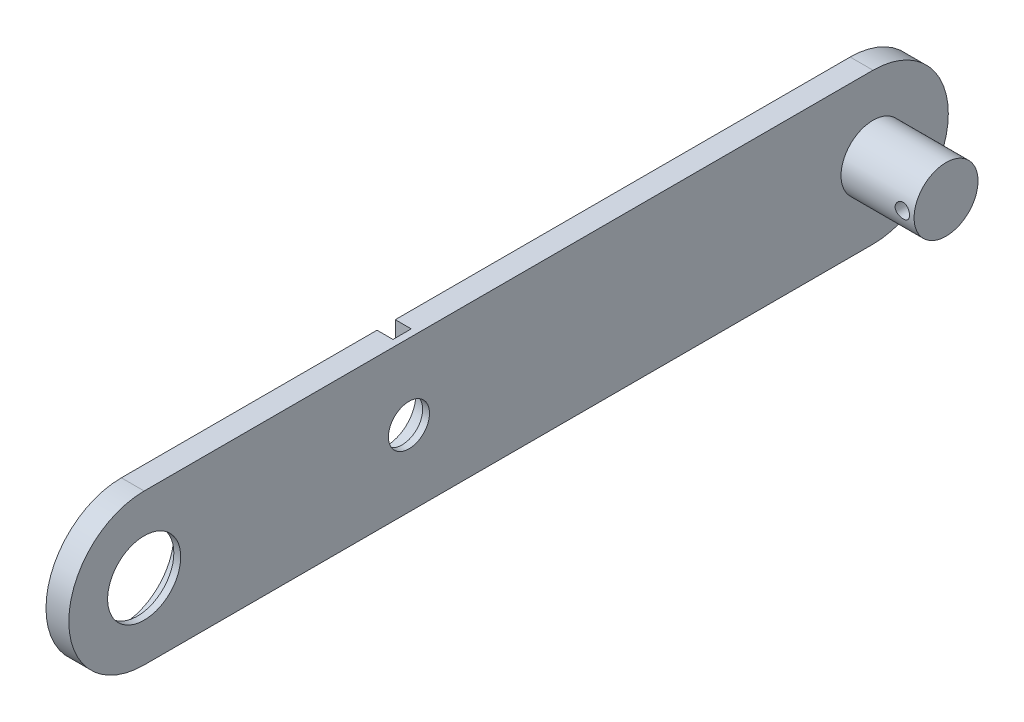
ISO-10303-21;
HEADER;
FILE_DESCRIPTION(('STEP AP214'),'2;1');
FILE_NAME('part.step','',(''),(''),'','','');
FILE_SCHEMA(('AUTOMOTIVE_DESIGN { 1 0 10303 214 1 1 1 1 }'));
ENDSEC;
DATA;
#1=APPLICATION_CONTEXT('core data for automotive mechanical design processes');
#2=APPLICATION_PROTOCOL_DEFINITION('international standard','automotive_design',2000,#1);
#3=PRODUCT_CONTEXT('',#1,'mechanical');
#4=PRODUCT('Part','Part','',(#3));
#5=PRODUCT_RELATED_PRODUCT_CATEGORY('part','',(#4));
#6=PRODUCT_DEFINITION_FORMATION('','',#4);
#7=PRODUCT_DEFINITION_CONTEXT('part definition',#1,'design');
#8=PRODUCT_DEFINITION('design','',#6,#7);
#9=PRODUCT_DEFINITION_SHAPE('','',#8);
#10=(LENGTH_UNIT() NAMED_UNIT(*) SI_UNIT(.MILLI.,.METRE.));
#11=(NAMED_UNIT(*) PLANE_ANGLE_UNIT() SI_UNIT($,.RADIAN.));
#12=(NAMED_UNIT(*) SI_UNIT($,.STERADIAN.) SOLID_ANGLE_UNIT());
#13=UNCERTAINTY_MEASURE_WITH_UNIT(LENGTH_MEASURE(1.E-05),#10,'distance_accuracy_value','');
#14=(GEOMETRIC_REPRESENTATION_CONTEXT(3) GLOBAL_UNCERTAINTY_ASSIGNED_CONTEXT((#13)) GLOBAL_UNIT_ASSIGNED_CONTEXT((#10,
#11,#12)) REPRESENTATION_CONTEXT('',''));
#15=CARTESIAN_POINT('',(0.,0.,0.));
#16=DIRECTION('',(0.,0.,1.));
#17=DIRECTION('',(1.,0.,0.));
#18=AXIS2_PLACEMENT_3D('',#15,#16,#17);
#19=CARTESIAN_POINT('',(17.5,0.,-101.62897727145));
#20=DIRECTION('',(-1.,0.,0.));
#21=DIRECTION('',(0.,0.,1.));
#22=AXIS2_PLACEMENT_3D('',#19,#20,#21);
#23=CYLINDRICAL_SURFACE('',#22,7.);
#24=CARTESIAN_POINT('',(16.5,0.,-94.6289772714496));
#25=CARTESIAN_POINT('',(16.4999971095468,-0.0872899861213126,-94.628978869588));
#26=CARTESIAN_POINT('',(16.4927188067638,-0.17461436314791,-94.6306265614614));
#27=CARTESIAN_POINT('',(16.4638306572922,-0.346778424822504,-94.637040293797));
#28=CARTESIAN_POINT('',(16.4422109743029,-0.431616362369988,-94.641808474474));
#29=CARTESIAN_POINT('',(16.3853548813518,-0.596294910858169,-94.6539328335885));
#30=CARTESIAN_POINT('',(16.3501331068488,-0.67614078619026,-94.6612862296488));
#31=CARTESIAN_POINT('',(16.267120088108,-0.828787702125348,-94.6777893984412));
#32=CARTESIAN_POINT('',(16.2193290227071,-0.901588842941153,-94.686939145614));
#33=CARTESIAN_POINT('',(16.1116785187539,-1.03931385877118,-94.7062075011215));
#34=CARTESIAN_POINT('',(16.0516469900669,-1.10410147154966,-94.7163387021759));
#35=CARTESIAN_POINT('',(15.9215888912573,-1.22277828306539,-94.7363403776201));
#36=CARTESIAN_POINT('',(15.8515613889837,-1.27666646426783,-94.7462108275922));
#37=CARTESIAN_POINT('',(15.7024820466169,-1.3726234409646,-94.7646980864747));
#38=CARTESIAN_POINT('',(15.6233337567596,-1.41454577335379,-94.7732987858579));
#39=CARTESIAN_POINT('',(15.4588898872216,-1.4844411000008,-94.7880914024876));
#40=CARTESIAN_POINT('',(15.3735950903043,-1.51241586691361,-94.7942836258155));
#41=CARTESIAN_POINT('',(15.2007615544076,-1.55316884379517,-94.8034296909133));
#42=CARTESIAN_POINT('',(15.1132826605646,-1.5661890465039,-94.8064350390268));
#43=CARTESIAN_POINT('',(14.937334512748,-1.57741600984558,-94.8090216650634));
#44=CARTESIAN_POINT('',(14.8488653893677,-1.57562470138648,-94.8086033893086));
#45=CARTESIAN_POINT('',(14.6752574941243,-1.5574739132486,-94.8044365959482));
#46=CARTESIAN_POINT('',(14.590087404167,-1.5413969001679,-94.8007526526789));
#47=CARTESIAN_POINT('',(14.4236851420759,-1.49557916917239,-94.7905718605375));
#48=CARTESIAN_POINT('',(14.3424532026754,-1.46583764481035,-94.7840748456459));
#49=CARTESIAN_POINT('',(14.1854460629172,-1.39327938401514,-94.7689371657944));
#50=CARTESIAN_POINT('',(14.1097222716766,-1.35035520798153,-94.7602790001066));
#51=CARTESIAN_POINT('',(13.966448398987,-1.25272556507102,-94.7418051417533));
#52=CARTESIAN_POINT('',(13.8988994950352,-1.19801840413961,-94.7319892827368));
#53=CARTESIAN_POINT('',(13.7722679841618,-1.07688659013386,-94.7120299478526));
#54=CARTESIAN_POINT('',(13.713414950386,-1.01022207908191,-94.701884119964));
#55=CARTESIAN_POINT('',(13.6076854091123,-0.867853161230144,-94.6826125485182));
#56=CARTESIAN_POINT('',(13.560809143765,-0.792148571700175,-94.6734868255879));
#57=CARTESIAN_POINT('',(13.4803019020482,-0.633559280225835,-94.6572513005981));
#58=CARTESIAN_POINT('',(13.4467023746,-0.550658090856842,-94.6501462960763));
#59=CARTESIAN_POINT('',(13.3939753402459,-0.38019065354933,-94.6387882160826));
#60=CARTESIAN_POINT('',(13.3748456035053,-0.292625126625219,-94.6345347011997));
#61=CARTESIAN_POINT('',(13.3519382509414,-0.117282647044653,-94.6294218762225));
#62=CARTESIAN_POINT('',(13.3478472286157,-0.0295486033449298,-94.6284932855919));
#63=CARTESIAN_POINT('',(13.354282034909,0.145349409003764,-94.6299401878712));
#64=CARTESIAN_POINT('',(13.3648068112493,0.232513418239007,-94.6323154429175));
#65=CARTESIAN_POINT('',(13.3999148165918,0.402749019106473,-94.6400592947118));
#66=CARTESIAN_POINT('',(13.4243324026057,0.485856519692085,-94.6453926042432));
#67=CARTESIAN_POINT('',(13.4863480307838,0.646795450537388,-94.6584550336394));
#68=CARTESIAN_POINT('',(13.5239472397701,0.724626412995977,-94.6661843655903));
#69=CARTESIAN_POINT('',(13.6119030356007,0.874089615853796,-94.6833515578167));
#70=CARTESIAN_POINT('',(13.6624421094229,0.945611667018305,-94.6928132543626));
#71=CARTESIAN_POINT('',(13.7746040955761,1.07927202933095,-94.7123492948554));
#72=CARTESIAN_POINT('',(13.8362285371484,1.14140904362229,-94.7224237232025));
#73=CARTESIAN_POINT('',(13.970253752316,1.25578477940571,-94.7422910501895));
#74=CARTESIAN_POINT('',(14.042841892365,1.30780588339238,-94.7520745748888));
#75=CARTESIAN_POINT('',(14.195907777316,1.39892136056197,-94.7700280602493));
#76=CARTESIAN_POINT('',(14.2763851749179,1.43801630244794,-94.7781980918919));
#77=CARTESIAN_POINT('',(14.44250870205,1.50189853021579,-94.7919187573394));
#78=CARTESIAN_POINT('',(14.5281220000794,1.52676781577292,-94.7974843690242));
#79=CARTESIAN_POINT('',(14.70245463474,1.56172934234186,-94.8053910700657));
#80=CARTESIAN_POINT('',(14.7911734385183,1.57182410581257,-94.8077327098481));
#81=CARTESIAN_POINT('',(14.9670009162417,1.57683786591717,-94.8088902314064));
#82=CARTESIAN_POINT('',(15.0540993849292,1.57210237871249,-94.8077863882727));
#83=CARTESIAN_POINT('',(15.2262228168791,1.54836598399252,-94.8023596411807));
#84=CARTESIAN_POINT('',(15.3112478075685,1.5293652652767,-94.798036779826));
#85=CARTESIAN_POINT('',(15.4765169830411,1.47780903924964,-94.7866993136607));
#86=CARTESIAN_POINT('',(15.5567784936471,1.44530659780169,-94.7796952551335));
#87=CARTESIAN_POINT('',(15.7107596286153,1.36771414019605,-94.7637810135434));
#88=CARTESIAN_POINT('',(15.7844785250585,1.32262272572057,-94.7548706187601));
#89=CARTESIAN_POINT('',(15.9249788048857,1.21999832474216,-94.7359099553552));
#90=CARTESIAN_POINT('',(15.9915785098901,1.1622203063352,-94.7258394150168));
#91=CARTESIAN_POINT('',(16.114250145116,1.03635584191832,-94.705826294047));
#92=CARTESIAN_POINT('',(16.1703196293617,0.968267007514182,-94.6958837436436));
#93=CARTESIAN_POINT('',(16.2710885449288,0.822572231851488,-94.6770826580714));
#94=CARTESIAN_POINT('',(16.3156190500476,0.744847129190773,-94.6682411169002));
#95=CARTESIAN_POINT('',(16.3909124410645,0.582830489017929,-94.6528101765245));
#96=CARTESIAN_POINT('',(16.421686560245,0.498544375427394,-94.6462189407933));
#97=CARTESIAN_POINT('',(16.4632806906157,0.345179203217054,-94.6371695668236));
#98=CARTESIAN_POINT('',(16.4770235207675,0.276912781529897,-94.6341168685487));
#99=CARTESIAN_POINT('',(16.4953841019366,0.139104811527382,-94.6300201336504));
#100=CARTESIAN_POINT('',(16.5000023034663,0.0695633263371569,-94.6289759978577));
#101=CARTESIAN_POINT('',(16.5,0.,-94.6289772714496));
#102=B_SPLINE_CURVE_WITH_KNOTS('',3,(#24,#25,#26,#27,#28,#29,#30,#31,#32,#33,#34,#35,#36,#37,
#38,#39,#40,#41,#42,#43,#44,#45,#46,#47,#48,#49,#50,#51,#52,#53,#54,#55,#56,#57,#58,#59,#60,#61,
#62,#63,#64,#65,#66,#67,#68,#69,#70,#71,#72,#73,#74,#75,#76,#77,#78,#79,#80,#81,#82,#83,#84,#85,
#86,#87,#88,#89,#90,#91,#92,#93,#94,#95,#96,#97,#98,#99,#100,#101),.UNSPECIFIED.,.T.,.F.,(4,2,2,
2,2,2,2,2,2,2,2,2,2,2,2,2,2,2,2,2,2,2,2,2,2,2,2,2,2,2,2,2,2,2,2,2,2,2,4),(0.,0.261615274364288,
0.523410168181868,0.784924159540375,1.04643443026112,1.31191208317623,1.57741450877731,
1.84603953754278,2.11463041691062,2.37881088860785,2.64295692086621,2.90199349988702,
3.16104536860018,3.42226722489961,3.68352666249189,3.95077507910684,4.2180288986187,
4.48591202722063,4.75375386588078,5.01598118451343,5.2781896248104,5.53733538902539,
5.79650409831639,6.05955111599233,6.32263444922333,6.59086867821547,6.85909110432859,
7.12575144278277,7.3923662489186,7.65281604288397,7.91326238987266,8.17269464613941,
8.43215573026739,8.69715527286611,8.96221629404097,9.2309626737525,9.49948919603384,
9.70798650616193,9.9164735218443),.UNSPECIFIED.);
#103=CARTESIAN_POINT('',(16.5,0.,-94.6289772714496));
#104=VERTEX_POINT('',#103);
#105=EDGE_CURVE('E59',#104,#104,#102,.T.);
#106=ORIENTED_EDGE('',*,*,#105,.T.);
#107=EDGE_LOOP('',(#106));
#108=FACE_BOUND('',#107,.T.);
#109=CARTESIAN_POINT('',(17.5,0.,-101.62897727145));
#110=DIRECTION('',(1.,0.,0.));
#111=DIRECTION('',(0.,0.,-1.));
#112=AXIS2_PLACEMENT_3D('',#109,#110,#111);
#113=CIRCLE('',#112,7.);
#114=CARTESIAN_POINT('',(17.5,0.,-108.62897727145));
#115=VERTEX_POINT('',#114);
#116=EDGE_CURVE('E207',#115,#115,#113,.T.);
#117=ORIENTED_EDGE('',*,*,#116,.F.);
#118=EDGE_LOOP('',(#117));
#119=FACE_BOUND('',#118,.T.);
#120=CARTESIAN_POINT('',(1.5,0.,-101.62897727145));
#121=DIRECTION('',(1.,0.,0.));
#122=DIRECTION('',(0.,0.,-1.));
#123=AXIS2_PLACEMENT_3D('',#120,#121,#122);
#124=CIRCLE('',#123,7.);
#125=CARTESIAN_POINT('',(1.5,0.,-108.62897727145));
#126=VERTEX_POINT('',#125);
#127=EDGE_CURVE('E211',#126,#126,#124,.T.);
#128=ORIENTED_EDGE('',*,*,#127,.T.);
#129=EDGE_LOOP('',(#128));
#130=FACE_BOUND('',#129,.T.);
#131=CARTESIAN_POINT('',(13.35,0.,-108.62897727145));
#132=CARTESIAN_POINT('',(13.3500028904532,0.0872899861213127,-108.628975673311));
#133=CARTESIAN_POINT('',(13.3572811932362,0.17461436314791,-108.627327981438));
#134=CARTESIAN_POINT('',(13.3861693427078,0.346778424822504,-108.620914249102));
#135=CARTESIAN_POINT('',(13.4077890256971,0.431616362369988,-108.616146068425));
#136=CARTESIAN_POINT('',(13.4646451186482,0.596294910858169,-108.604021709311));
#137=CARTESIAN_POINT('',(13.4998668931512,0.67614078619026,-108.59666831325));
#138=CARTESIAN_POINT('',(13.582879911892,0.828787702125348,-108.580165144458));
#139=CARTESIAN_POINT('',(13.630670977293,0.901588842941154,-108.571015397285));
#140=CARTESIAN_POINT('',(13.7383214812461,1.03931385877118,-108.551747041778));
#141=CARTESIAN_POINT('',(13.7983530099331,1.10410147154966,-108.541615840723));
#142=CARTESIAN_POINT('',(13.9284111087427,1.22277828306539,-108.521614165279));
#143=CARTESIAN_POINT('',(13.9984386110163,1.27666646426783,-108.511743715307));
#144=CARTESIAN_POINT('',(14.1475179533831,1.3726234409646,-108.493256456425));
#145=CARTESIAN_POINT('',(14.2266662432404,1.41454577335379,-108.484655757041));
#146=CARTESIAN_POINT('',(14.3911101127784,1.4844411000008,-108.469863140412));
#147=CARTESIAN_POINT('',(14.4764049096957,1.51241586691361,-108.463670917084));
#148=CARTESIAN_POINT('',(14.6492384455924,1.55316884379517,-108.454524851986));
#149=CARTESIAN_POINT('',(14.7367173394354,1.5661890465039,-108.451519503872));
#150=CARTESIAN_POINT('',(14.912665487252,1.57741600984558,-108.448932877836));
#151=CARTESIAN_POINT('',(15.0011346106323,1.57562470138648,-108.449351153591));
#152=CARTESIAN_POINT('',(15.1747425058757,1.5574739132486,-108.453517946951));
#153=CARTESIAN_POINT('',(15.259912595833,1.5413969001679,-108.45720189022));
#154=CARTESIAN_POINT('',(15.4263148579241,1.49557916917239,-108.467382682362));
#155=CARTESIAN_POINT('',(15.5075467973246,1.46583764481035,-108.473879697253));
#156=CARTESIAN_POINT('',(15.6645539370828,1.39327938401514,-108.489017377105));
#157=CARTESIAN_POINT('',(15.7402777283234,1.35035520798153,-108.497675542793));
#158=CARTESIAN_POINT('',(15.883551601013,1.25272556507101,-108.516149401146));
#159=CARTESIAN_POINT('',(15.9511005049648,1.19801840413961,-108.525965260162));
#160=CARTESIAN_POINT('',(16.0777320158382,1.07688659013386,-108.545924595047));
#161=CARTESIAN_POINT('',(16.136585049614,1.01022207908191,-108.556070422935));
#162=CARTESIAN_POINT('',(16.2423145908877,0.867853161230143,-108.575341994381));
#163=CARTESIAN_POINT('',(16.289190856235,0.792148571700174,-108.584467717311));
#164=CARTESIAN_POINT('',(16.3696980979518,0.633559280225835,-108.600703242301));
#165=CARTESIAN_POINT('',(16.4032976254,0.550658090856843,-108.607808246823));
#166=CARTESIAN_POINT('',(16.4560246597541,0.38019065354933,-108.619166326817));
#167=CARTESIAN_POINT('',(16.4751543964947,0.29262512662522,-108.6234198417));
#168=CARTESIAN_POINT('',(16.4980617490586,0.117282647044653,-108.628532666677));
#169=CARTESIAN_POINT('',(16.5021527713843,0.0295486033449297,-108.629461257307));
#170=CARTESIAN_POINT('',(16.495717965091,-0.145349409003764,-108.628014355028));
#171=CARTESIAN_POINT('',(16.4851931887507,-0.232513418239007,-108.625639099982));
#172=CARTESIAN_POINT('',(16.4500851834082,-0.402749019106474,-108.617895248187));
#173=CARTESIAN_POINT('',(16.4256675973943,-0.485856519692086,-108.612561938656));
#174=CARTESIAN_POINT('',(16.3636519692162,-0.646795450537389,-108.59949950926));
#175=CARTESIAN_POINT('',(16.3260527602299,-0.724626412995978,-108.591770177309));
#176=CARTESIAN_POINT('',(16.2380969643993,-0.874089615853796,-108.574602985083));
#177=CARTESIAN_POINT('',(16.1875578905771,-0.945611667018304,-108.565141288537));
#178=CARTESIAN_POINT('',(16.0753959044239,-1.07927202933095,-108.545605248044));
#179=CARTESIAN_POINT('',(16.0137714628516,-1.14140904362229,-108.535530819697));
#180=CARTESIAN_POINT('',(15.879746247684,-1.25578477940571,-108.51566349271));
#181=CARTESIAN_POINT('',(15.807158107635,-1.30780588339238,-108.50587996801));
#182=CARTESIAN_POINT('',(15.654092222684,-1.39892136056197,-108.48792648265));
#183=CARTESIAN_POINT('',(15.5736148250821,-1.43801630244794,-108.479756451007));
#184=CARTESIAN_POINT('',(15.40749129795,-1.50189853021579,-108.46603578556));
#185=CARTESIAN_POINT('',(15.3218779999207,-1.52676781577292,-108.460470173875));
#186=CARTESIAN_POINT('',(15.14754536526,-1.56172934234186,-108.452563472834));
#187=CARTESIAN_POINT('',(15.0588265614817,-1.57182410581257,-108.450221833051));
#188=CARTESIAN_POINT('',(14.8829990837583,-1.57683786591717,-108.449064311493));
#189=CARTESIAN_POINT('',(14.7959006150708,-1.57210237871249,-108.450168154627));
#190=CARTESIAN_POINT('',(14.6237771831209,-1.54836598399252,-108.455594901719));
#191=CARTESIAN_POINT('',(14.5387521924315,-1.5293652652767,-108.459917763073));
#192=CARTESIAN_POINT('',(14.3734830169589,-1.47780903924964,-108.471255229239));
#193=CARTESIAN_POINT('',(14.2932215063529,-1.44530659780169,-108.478259287766));
#194=CARTESIAN_POINT('',(14.1392403713847,-1.36771414019605,-108.494173529356));
#195=CARTESIAN_POINT('',(14.0655214749415,-1.32262272572057,-108.503083924139));
#196=CARTESIAN_POINT('',(13.9250211951143,-1.21999832474215,-108.522044587544));
#197=CARTESIAN_POINT('',(13.8584214901099,-1.16222030633519,-108.532115127882));
#198=CARTESIAN_POINT('',(13.735749854884,-1.03635584191832,-108.552128248852));
#199=CARTESIAN_POINT('',(13.6796803706383,-0.968267007514183,-108.562070799256));
#200=CARTESIAN_POINT('',(13.5789114550712,-0.822572231851489,-108.580871884828));
#201=CARTESIAN_POINT('',(13.5343809499524,-0.744847129190775,-108.589713425999));
#202=CARTESIAN_POINT('',(13.4590875589355,-0.582830489017929,-108.605144366375));
#203=CARTESIAN_POINT('',(13.428313439755,-0.498544375427394,-108.611735602106));
#204=CARTESIAN_POINT('',(13.3867193093843,-0.345179203217052,-108.620784976076));
#205=CARTESIAN_POINT('',(13.3729764792325,-0.276912781529895,-108.62383767435));
#206=CARTESIAN_POINT('',(13.3546158980634,-0.13910481152738,-108.627934409249));
#207=CARTESIAN_POINT('',(13.3499976965337,-0.069563326337156,-108.628978545042));
#208=CARTESIAN_POINT('',(13.35,0.,-108.62897727145));
#209=B_SPLINE_CURVE_WITH_KNOTS('',3,(#131,#132,#133,#134,#135,#136,#137,#138,#139,#140,#141,
#142,#143,#144,#145,#146,#147,#148,#149,#150,#151,#152,#153,#154,#155,#156,#157,#158,#159,#160,
#161,#162,#163,#164,#165,#166,#167,#168,#169,#170,#171,#172,#173,#174,#175,#176,#177,#178,#179,
#180,#181,#182,#183,#184,#185,#186,#187,#188,#189,#190,#191,#192,#193,#194,#195,#196,#197,#198,
#199,#200,#201,#202,#203,#204,#205,#206,#207,#208),.UNSPECIFIED.,.T.,.F.,(4,2,2,2,2,2,2,2,2,2,2,
2,2,2,2,2,2,2,2,2,2,2,2,2,2,2,2,2,2,2,2,2,2,2,2,2,2,2,4),(0.,0.261615274364289,
0.523410168181868,0.784924159540376,1.04643443026112,1.31191208317623,1.5774145087773,
1.84603953754278,2.11463041691062,2.37881088860785,2.64295692086621,2.90199349988702,
3.16104536860018,3.42226722489961,3.68352666249189,3.95077507910684,4.21802889861869,
4.48591202722063,4.75375386588078,5.01598118451343,5.2781896248104,5.5373353890254,
5.79650409831639,6.05955111599233,6.32263444922333,6.59086867821547,6.85909110432859,
7.12575144278276,7.3923662489186,7.65281604288397,7.91326238987266,8.17269464613942,
8.43215573026739,8.69715527286612,8.96221629404097,9.2309626737525,9.49948919603384,
9.70798650616193,9.91647352184429),.UNSPECIFIED.);
#210=CARTESIAN_POINT('',(13.35,0.,-108.62897727145));
#211=VERTEX_POINT('',#210);
#212=EDGE_CURVE('E11',#211,#211,#209,.T.);
#213=ORIENTED_EDGE('',*,*,#212,.F.);
#214=EDGE_LOOP('',(#213));
#215=FACE_BOUND('',#214,.T.);
#216=ADVANCED_FACE('F45',(#108,#119,#130,#215),#23,.T.);
#217=CARTESIAN_POINT('',(-3.5,0.,-101.62897727145));
#218=DIRECTION('',(-1.,0.,0.));
#219=DIRECTION('',(0.,0.,1.));
#220=AXIS2_PLACEMENT_3D('',#217,#218,#219);
#221=PLANE('',#220);
#222=DIRECTION('',(0.,-1.,0.));
#223=VECTOR('',#222,1.);
#224=CARTESIAN_POINT('',(-3.5,16.5,-2.));
#225=LINE('',#224,#223);
#226=CARTESIAN_POINT('',(-3.5,16.5,-2.));
#227=VERTEX_POINT('',#226);
#228=CARTESIAN_POINT('',(-3.5,6.18465843842649,-2.));
#229=VERTEX_POINT('',#228);
#230=EDGE_CURVE('E129',#227,#229,#225,.T.);
#231=ORIENTED_EDGE('',*,*,#230,.F.);
#232=DIRECTION('',(0.,0.,-1.));
#233=VECTOR('',#232,1.);
#234=CARTESIAN_POINT('',(-3.5,16.5,-101.62897727145));
#235=LINE('',#234,#233);
#236=CARTESIAN_POINT('',(-3.5,16.5,-101.62897727145));
#237=VERTEX_POINT('',#236);
#238=EDGE_CURVE('E74',#227,#237,#235,.T.);
#239=ORIENTED_EDGE('',*,*,#238,.T.);
#240=CARTESIAN_POINT('',(-3.5,0.,-101.62897727145));
#241=DIRECTION('',(-1.,0.,0.));
#242=DIRECTION('',(0.,0.,1.));
#243=AXIS2_PLACEMENT_3D('',#240,#241,#242);
#244=CIRCLE('',#243,16.5);
#245=CARTESIAN_POINT('',(-3.5,-16.5,-101.62897727145));
#246=VERTEX_POINT('',#245);
#247=EDGE_CURVE('E299',#237,#246,#244,.T.);
#248=ORIENTED_EDGE('',*,*,#247,.T.);
#249=DIRECTION('',(0.,0.,1.));
#250=VECTOR('',#249,1.);
#251=CARTESIAN_POINT('',(-3.5,-16.5,-101.62897727145));
#252=LINE('',#251,#250);
#253=CARTESIAN_POINT('',(-3.5,-16.5,57.9976885999372));
#254=VERTEX_POINT('',#253);
#255=EDGE_CURVE('E303',#246,#254,#252,.T.);
#256=ORIENTED_EDGE('',*,*,#255,.T.);
#257=CARTESIAN_POINT('',(-3.5,0.,57.9976885999372));
#258=DIRECTION('',(-1.,0.,0.));
#259=DIRECTION('',(0.,0.,1.));
#260=AXIS2_PLACEMENT_3D('',#257,#258,#259);
#261=CIRCLE('',#260,16.5);
#262=CARTESIAN_POINT('',(-3.5,16.5,57.9976885999372));
#263=VERTEX_POINT('',#262);
#264=EDGE_CURVE('E144',#254,#263,#261,.T.);
#265=ORIENTED_EDGE('',*,*,#264,.T.);
#266=CARTESIAN_POINT('',(-3.5,16.5,2.));
#267=VERTEX_POINT('',#266);
#268=EDGE_CURVE('E135',#263,#267,#235,.T.);
#269=ORIENTED_EDGE('',*,*,#268,.T.);
#270=DIRECTION('',(0.,1.,0.));
#271=VECTOR('',#270,1.);
#272=CARTESIAN_POINT('',(-3.5,16.5,2.));
#273=LINE('',#272,#271);
#274=CARTESIAN_POINT('',(-3.5,6.18465843842649,2.));
#275=VERTEX_POINT('',#274);
#276=EDGE_CURVE('E118',#275,#267,#273,.T.);
#277=ORIENTED_EDGE('',*,*,#276,.F.);
#278=CARTESIAN_POINT('',(-3.5,0.,0.));
#279=DIRECTION('',(-1.,0.,0.));
#280=DIRECTION('',(0.,0.,1.));
#281=AXIS2_PLACEMENT_3D('',#278,#279,#280);
#282=CIRCLE('',#281,6.5);
#283=EDGE_CURVE('E296',#229,#275,#282,.T.);
#284=ORIENTED_EDGE('',*,*,#283,.F.);
#285=EDGE_LOOP('',(#231,#239,#248,#256,#265,#269,#277,#284));
#286=FACE_BOUND('',#285,.T.);
#287=CARTESIAN_POINT('',(-3.5,0.,57.9976885999372));
#288=DIRECTION('',(-1.,0.,0.));
#289=DIRECTION('',(0.,0.,1.));
#290=AXIS2_PLACEMENT_3D('',#287,#288,#289);
#291=CIRCLE('',#290,11.5);
#292=CARTESIAN_POINT('',(-3.5,0.,69.4976885999372));
#293=VERTEX_POINT('',#292);
#294=EDGE_CURVE('E288',#293,#293,#291,.T.);
#295=ORIENTED_EDGE('',*,*,#294,.F.);
#296=EDGE_LOOP('',(#295));
#297=FACE_BOUND('',#296,.T.);
#298=ADVANCED_FACE('F141',(#286,#297),#221,.T.);
#299=CARTESIAN_POINT('',(-3.5,0.,-101.62897727145));
#300=DIRECTION('',(1.,0.,0.));
#301=DIRECTION('',(0.,0.,-1.));
#302=AXIS2_PLACEMENT_3D('',#299,#300,#301);
#303=CYLINDRICAL_SURFACE('',#302,16.5);
#304=DIRECTION('',(1.,0.,0.));
#305=VECTOR('',#304,1.);
#306=CARTESIAN_POINT('',(-3.5,16.5,-101.62897727145));
#307=LINE('',#306,#305);
#308=CARTESIAN_POINT('',(1.5,16.5,-101.62897727145));
#309=VERTEX_POINT('',#308);
#310=EDGE_CURVE('E147',#237,#309,#307,.T.);
#311=ORIENTED_EDGE('',*,*,#310,.T.);
#312=CARTESIAN_POINT('',(1.5,0.,-101.62897727145));
#313=DIRECTION('',(1.,0.,0.));
#314=DIRECTION('',(0.,0.,-1.));
#315=AXIS2_PLACEMENT_3D('',#312,#313,#314);
#316=CIRCLE('',#315,16.5);
#317=CARTESIAN_POINT('',(1.5,-16.5,-101.62897727145));
#318=VERTEX_POINT('',#317);
#319=EDGE_CURVE('E268',#318,#309,#316,.T.);
#320=ORIENTED_EDGE('',*,*,#319,.F.);
#321=DIRECTION('',(1.,0.,0.));
#322=VECTOR('',#321,1.);
#323=CARTESIAN_POINT('',(-3.5,-16.5,-101.62897727145));
#324=LINE('',#323,#322);
#325=EDGE_CURVE('E161',#246,#318,#324,.T.);
#326=ORIENTED_EDGE('',*,*,#325,.F.);
#327=ORIENTED_EDGE('',*,*,#247,.F.);
#328=EDGE_LOOP('',(#311,#320,#326,#327));
#329=FACE_BOUND('',#328,.T.);
#330=ADVANCED_FACE('F47',(#329),#303,.T.);
#331=CARTESIAN_POINT('',(-3.5,-16.5,-101.62897727145));
#332=DIRECTION('',(0.,1.,0.));
#333=DIRECTION('',(0.,0.,1.));
#334=AXIS2_PLACEMENT_3D('',#331,#332,#333);
#335=PLANE('',#334);
#336=ORIENTED_EDGE('',*,*,#325,.T.);
#337=DIRECTION('',(0.,0.,-1.));
#338=VECTOR('',#337,1.);
#339=CARTESIAN_POINT('',(1.5,-16.5,57.9976885999372));
#340=LINE('',#339,#338);
#341=CARTESIAN_POINT('',(1.5,-16.5,57.9976885999372));
#342=VERTEX_POINT('',#341);
#343=EDGE_CURVE('E283',#342,#318,#340,.T.);
#344=ORIENTED_EDGE('',*,*,#343,.F.);
#345=DIRECTION('',(1.,0.,0.));
#346=VECTOR('',#345,1.);
#347=CARTESIAN_POINT('',(-3.5,-16.5,57.9976885999372));
#348=LINE('',#347,#346);
#349=EDGE_CURVE('E158',#254,#342,#348,.T.);
#350=ORIENTED_EDGE('',*,*,#349,.F.);
#351=ORIENTED_EDGE('',*,*,#255,.F.);
#352=EDGE_LOOP('',(#336,#344,#350,#351));
#353=FACE_BOUND('',#352,.T.);
#354=ADVANCED_FACE('F311',(#353),#335,.F.);
#355=CARTESIAN_POINT('',(-3.5,0.,57.9976885999372));
#356=DIRECTION('',(1.,0.,0.));
#357=DIRECTION('',(0.,0.,-1.));
#358=AXIS2_PLACEMENT_3D('',#355,#356,#357);
#359=CYLINDRICAL_SURFACE('',#358,16.5);
#360=ORIENTED_EDGE('',*,*,#349,.T.);
#361=CARTESIAN_POINT('',(1.5,0.,57.9976885999372));
#362=DIRECTION('',(1.,0.,0.));
#363=DIRECTION('',(0.,0.,-1.));
#364=AXIS2_PLACEMENT_3D('',#361,#362,#363);
#365=CIRCLE('',#364,16.5);
#366=CARTESIAN_POINT('',(1.5,16.5,57.9976885999372));
#367=VERTEX_POINT('',#366);
#368=EDGE_CURVE('E279',#367,#342,#365,.T.);
#369=ORIENTED_EDGE('',*,*,#368,.F.);
#370=DIRECTION('',(1.,0.,0.));
#371=VECTOR('',#370,1.);
#372=CARTESIAN_POINT('',(-3.5,16.5,57.9976885999372));
#373=LINE('',#372,#371);
#374=EDGE_CURVE('E151',#263,#367,#373,.T.);
#375=ORIENTED_EDGE('',*,*,#374,.F.);
#376=ORIENTED_EDGE('',*,*,#264,.F.);
#377=EDGE_LOOP('',(#360,#369,#375,#376));
#378=FACE_BOUND('',#377,.T.);
#379=ADVANCED_FACE('F314',(#378),#359,.T.);
#380=CARTESIAN_POINT('',(-3.5,16.5,-101.62897727145));
#381=DIRECTION('',(0.,-1.,0.));
#382=DIRECTION('',(0.,0.,-1.));
#383=AXIS2_PLACEMENT_3D('',#380,#381,#382);
#384=PLANE('',#383);
#385=ORIENTED_EDGE('',*,*,#238,.F.);
#386=DIRECTION('',(-1.,0.,0.));
#387=VECTOR('',#386,1.);
#388=CARTESIAN_POINT('',(11.0637367797651,16.5,-2.));
#389=LINE('',#388,#387);
#390=CARTESIAN_POINT('',(0.,16.5,-2.));
#391=VERTEX_POINT('',#390);
#392=EDGE_CURVE('E241',#391,#227,#389,.T.);
#393=ORIENTED_EDGE('',*,*,#392,.F.);
#394=DIRECTION('',(0.,0.,-1.));
#395=VECTOR('',#394,1.);
#396=CARTESIAN_POINT('',(0.,16.5,-2.));
#397=LINE('',#396,#395);
#398=CARTESIAN_POINT('',(0.,16.5,2.));
#399=VERTEX_POINT('',#398);
#400=EDGE_CURVE('E137',#399,#391,#397,.T.);
#401=ORIENTED_EDGE('',*,*,#400,.F.);
#402=DIRECTION('',(-1.,0.,0.));
#403=VECTOR('',#402,1.);
#404=CARTESIAN_POINT('',(11.0637367797651,16.5,2.));
#405=LINE('',#404,#403);
#406=EDGE_CURVE('E121',#399,#267,#405,.T.);
#407=ORIENTED_EDGE('',*,*,#406,.T.);
#408=ORIENTED_EDGE('',*,*,#268,.F.);
#409=ORIENTED_EDGE('',*,*,#374,.T.);
#410=DIRECTION('',(0.,0.,1.));
#411=VECTOR('',#410,1.);
#412=CARTESIAN_POINT('',(1.5,16.5,-101.62897727145));
#413=LINE('',#412,#411);
#414=EDGE_CURVE('E275',#309,#367,#413,.T.);
#415=ORIENTED_EDGE('',*,*,#414,.F.);
#416=ORIENTED_EDGE('',*,*,#310,.F.);
#417=EDGE_LOOP('',(#385,#393,#401,#407,#408,#409,#415,#416));
#418=FACE_BOUND('',#417,.T.);
#419=ADVANCED_FACE('F134',(#418),#384,.F.);
#420=CARTESIAN_POINT('',(-3.5,0.,0.));
#421=DIRECTION('',(1.,0.,0.));
#422=DIRECTION('',(0.,0.,-1.));
#423=AXIS2_PLACEMENT_3D('',#420,#421,#422);
#424=CYLINDRICAL_SURFACE('',#423,6.5);
#425=DIRECTION('',(-1.,0.,0.));
#426=VECTOR('',#425,1.);
#427=CARTESIAN_POINT('',(11.0637367797651,6.18465843842649,-2.));
#428=LINE('',#427,#426);
#429=CARTESIAN_POINT('',(0.,6.18465843842649,-2.));
#430=VERTEX_POINT('',#429);
#431=EDGE_CURVE('E238',#430,#229,#428,.T.);
#432=ORIENTED_EDGE('',*,*,#431,.T.);
#433=ORIENTED_EDGE('',*,*,#283,.T.);
#434=DIRECTION('',(-1.,0.,0.));
#435=VECTOR('',#434,1.);
#436=CARTESIAN_POINT('',(11.0637367797651,6.18465843842649,2.));
#437=LINE('',#436,#435);
#438=CARTESIAN_POINT('',(0.,6.18465843842649,2.));
#439=VERTEX_POINT('',#438);
#440=EDGE_CURVE('E124',#439,#275,#437,.T.);
#441=ORIENTED_EDGE('',*,*,#440,.F.);
#442=CARTESIAN_POINT('',(0.,0.,0.));
#443=DIRECTION('',(-1.,0.,0.));
#444=DIRECTION('',(0.,0.,1.));
#445=AXIS2_PLACEMENT_3D('',#442,#443,#444);
#446=CIRCLE('',#445,6.5);
#447=EDGE_CURVE('E292',#430,#439,#446,.T.);
#448=ORIENTED_EDGE('',*,*,#447,.F.);
#449=EDGE_LOOP('',(#432,#433,#441,#448));
#450=FACE_BOUND('',#449,.T.);
#451=ADVANCED_FACE('F322',(#450),#424,.F.);
#452=CARTESIAN_POINT('',(-3.5,0.,57.9976885999372));
#453=DIRECTION('',(1.,0.,0.));
#454=DIRECTION('',(0.,0.,-1.));
#455=AXIS2_PLACEMENT_3D('',#452,#453,#454);
#456=CYLINDRICAL_SURFACE('',#455,11.5);
#457=ORIENTED_EDGE('',*,*,#294,.T.);
#458=EDGE_LOOP('',(#457));
#459=FACE_BOUND('',#458,.T.);
#460=CARTESIAN_POINT('',(0.,0.,57.9976885999372));
#461=DIRECTION('',(-1.,0.,0.));
#462=DIRECTION('',(0.,0.,1.));
#463=AXIS2_PLACEMENT_3D('',#460,#461,#462);
#464=CIRCLE('',#463,11.5);
#465=CARTESIAN_POINT('',(0.,0.,69.4976885999372));
#466=VERTEX_POINT('',#465);
#467=EDGE_CURVE('E287',#466,#466,#464,.T.);
#468=ORIENTED_EDGE('',*,*,#467,.F.);
#469=EDGE_LOOP('',(#468));
#470=FACE_BOUND('',#469,.T.);
#471=ADVANCED_FACE('F327',(#459,#470),#456,.F.);
#472=CARTESIAN_POINT('',(0.,0.,-101.62897727145));
#473=DIRECTION('',(1.,0.,0.));
#474=DIRECTION('',(0.,0.,-1.));
#475=AXIS2_PLACEMENT_3D('',#472,#473,#474);
#476=PLANE('',#475);
#477=CARTESIAN_POINT('',(0.,0.,0.));
#478=DIRECTION('',(1.,0.,0.));
#479=DIRECTION('',(0.,0.,-1.));
#480=AXIS2_PLACEMENT_3D('',#477,#478,#479);
#481=CIRCLE('',#480,4.5);
#482=CARTESIAN_POINT('',(0.,0.,-4.5));
#483=VERTEX_POINT('',#482);
#484=EDGE_CURVE('E253',#483,#483,#481,.T.);
#485=ORIENTED_EDGE('',*,*,#484,.T.);
#486=EDGE_LOOP('',(#485));
#487=FACE_BOUND('',#486,.T.);
#488=ORIENTED_EDGE('',*,*,#447,.T.);
#489=DIRECTION('',(0.,1.,0.));
#490=VECTOR('',#489,1.);
#491=CARTESIAN_POINT('',(0.,16.5,2.));
#492=LINE('',#491,#490);
#493=EDGE_CURVE('E139',#439,#399,#492,.T.);
#494=ORIENTED_EDGE('',*,*,#493,.T.);
#495=ORIENTED_EDGE('',*,*,#400,.T.);
#496=DIRECTION('',(0.,-1.,0.));
#497=VECTOR('',#496,1.);
#498=CARTESIAN_POINT('',(0.,16.5,-2.));
#499=LINE('',#498,#497);
#500=EDGE_CURVE('E66',#391,#430,#499,.T.);
#501=ORIENTED_EDGE('',*,*,#500,.T.);
#502=EDGE_LOOP('',(#488,#494,#495,#501));
#503=FACE_BOUND('',#502,.T.);
#504=ADVANCED_FACE('F324',(#487,#503),#476,.F.);
#505=CARTESIAN_POINT('',(0.,0.,57.9976885999372));
#506=DIRECTION('',(1.,0.,0.));
#507=DIRECTION('',(0.,0.,-1.));
#508=AXIS2_PLACEMENT_3D('',#505,#506,#507);
#509=CIRCLE('',#508,8.);
#510=CARTESIAN_POINT('',(0.,0.,49.9976885999372));
#511=VERTEX_POINT('',#510);
#512=EDGE_CURVE('E260',#511,#511,#509,.T.);
#513=ORIENTED_EDGE('',*,*,#512,.T.);
#514=EDGE_LOOP('',(#513));
#515=FACE_BOUND('',#514,.T.);
#516=ORIENTED_EDGE('',*,*,#467,.T.);
#517=EDGE_LOOP('',(#516));
#518=FACE_BOUND('',#517,.T.);
#519=ADVANCED_FACE('F326',(#515,#518),#476,.F.);
#520=CARTESIAN_POINT('',(1.5,0.,-101.62897727145));
#521=DIRECTION('',(1.,0.,0.));
#522=DIRECTION('',(0.,0.,-1.));
#523=AXIS2_PLACEMENT_3D('',#520,#521,#522);
#524=PLANE('',#523);
#525=ORIENTED_EDGE('',*,*,#127,.F.);
#526=EDGE_LOOP('',(#525));
#527=FACE_BOUND('',#526,.T.);
#528=CARTESIAN_POINT('',(1.5,0.,57.9976885999372));
#529=DIRECTION('',(1.,0.,0.));
#530=DIRECTION('',(0.,0.,-1.));
#531=AXIS2_PLACEMENT_3D('',#528,#529,#530);
#532=CIRCLE('',#531,8.);
#533=CARTESIAN_POINT('',(1.5,0.,49.9976885999372));
#534=VERTEX_POINT('',#533);
#535=EDGE_CURVE('E264',#534,#534,#532,.T.);
#536=ORIENTED_EDGE('',*,*,#535,.F.);
#537=EDGE_LOOP('',(#536));
#538=FACE_BOUND('',#537,.T.);
#539=ORIENTED_EDGE('',*,*,#319,.T.);
#540=ORIENTED_EDGE('',*,*,#414,.T.);
#541=ORIENTED_EDGE('',*,*,#368,.T.);
#542=ORIENTED_EDGE('',*,*,#343,.T.);
#543=EDGE_LOOP('',(#539,#540,#541,#542));
#544=FACE_BOUND('',#543,.T.);
#545=CARTESIAN_POINT('',(1.5,0.,0.));
#546=DIRECTION('',(1.,0.,0.));
#547=DIRECTION('',(0.,0.,-1.));
#548=AXIS2_PLACEMENT_3D('',#545,#546,#547);
#549=CIRCLE('',#548,4.5);
#550=CARTESIAN_POINT('',(1.5,0.,-4.5));
#551=VERTEX_POINT('',#550);
#552=EDGE_CURVE('E256',#551,#551,#549,.T.);
#553=ORIENTED_EDGE('',*,*,#552,.F.);
#554=EDGE_LOOP('',(#553));
#555=FACE_BOUND('',#554,.T.);
#556=ADVANCED_FACE('F317',(#527,#538,#544,#555),#524,.T.);
#557=CARTESIAN_POINT('',(1.5,0.,57.9976885999372));
#558=DIRECTION('',(-1.,0.,0.));
#559=DIRECTION('',(0.,0.,1.));
#560=AXIS2_PLACEMENT_3D('',#557,#558,#559);
#561=CYLINDRICAL_SURFACE('',#560,8.);
#562=ORIENTED_EDGE('',*,*,#535,.T.);
#563=EDGE_LOOP('',(#562));
#564=FACE_BOUND('',#563,.T.);
#565=ORIENTED_EDGE('',*,*,#512,.F.);
#566=EDGE_LOOP('',(#565));
#567=FACE_BOUND('',#566,.T.);
#568=ADVANCED_FACE('F193',(#564,#567),#561,.F.);
#569=CARTESIAN_POINT('',(1.5,0.,0.));
#570=DIRECTION('',(-1.,0.,0.));
#571=DIRECTION('',(0.,0.,1.));
#572=AXIS2_PLACEMENT_3D('',#569,#570,#571);
#573=CYLINDRICAL_SURFACE('',#572,4.5);
#574=ORIENTED_EDGE('',*,*,#552,.T.);
#575=EDGE_LOOP('',(#574));
#576=FACE_BOUND('',#575,.T.);
#577=ORIENTED_EDGE('',*,*,#484,.F.);
#578=EDGE_LOOP('',(#577));
#579=FACE_BOUND('',#578,.T.);
#580=ADVANCED_FACE('F186',(#576,#579),#573,.F.);
#581=CARTESIAN_POINT('',(17.5,0.,-101.62897727145));
#582=DIRECTION('',(1.,0.,0.));
#583=DIRECTION('',(0.,0.,-1.));
#584=AXIS2_PLACEMENT_3D('',#581,#582,#583);
#585=PLANE('',#584);
#586=ORIENTED_EDGE('',*,*,#116,.T.);
#587=EDGE_LOOP('',(#586));
#588=FACE_BOUND('',#587,.T.);
#589=ADVANCED_FACE('F183',(#588),#585,.T.);
#590=CARTESIAN_POINT('',(11.0637367797651,16.5,-2.));
#591=DIRECTION('',(0.,0.,-1.));
#592=DIRECTION('',(0.,1.,0.));
#593=AXIS2_PLACEMENT_3D('',#590,#591,#592);
#594=PLANE('',#593);
#595=ORIENTED_EDGE('',*,*,#392,.T.);
#596=ORIENTED_EDGE('',*,*,#230,.T.);
#597=ORIENTED_EDGE('',*,*,#431,.F.);
#598=ORIENTED_EDGE('',*,*,#500,.F.);
#599=EDGE_LOOP('',(#595,#596,#597,#598));
#600=FACE_BOUND('',#599,.T.);
#601=ADVANCED_FACE('F181',(#600),#594,.F.);
#602=CARTESIAN_POINT('',(11.0637367797651,16.5,2.));
#603=DIRECTION('',(0.,0.,1.));
#604=DIRECTION('',(0.,-1.,0.));
#605=AXIS2_PLACEMENT_3D('',#602,#603,#604);
#606=PLANE('',#605);
#607=ORIENTED_EDGE('',*,*,#440,.T.);
#608=ORIENTED_EDGE('',*,*,#276,.T.);
#609=ORIENTED_EDGE('',*,*,#406,.F.);
#610=ORIENTED_EDGE('',*,*,#493,.F.);
#611=EDGE_LOOP('',(#607,#608,#609,#610));
#612=FACE_BOUND('',#611,.T.);
#613=ADVANCED_FACE('F120',(#612),#606,.F.);
#614=CARTESIAN_POINT('',(14.925,0.,-97.6289772714496));
#615=DIRECTION('',(0.,0.,1.));
#616=DIRECTION('',(1.,0.,0.));
#617=AXIS2_PLACEMENT_3D('',#614,#615,#616);
#618=CYLINDRICAL_SURFACE('',#617,1.575);
#619=CARTESIAN_POINT('',(14.925,0.,-97.6289772714496));
#620=DIRECTION('',(0.,0.,1.));
#621=DIRECTION('',(1.,0.,0.));
#622=AXIS2_PLACEMENT_3D('',#619,#620,#621);
#623=CIRCLE('',#622,1.575);
#624=CARTESIAN_POINT('',(16.5,0.,-97.6289772714496));
#625=VERTEX_POINT('',#624);
#626=EDGE_CURVE('E228',#625,#625,#623,.T.);
#627=ORIENTED_EDGE('',*,*,#626,.F.);
#628=EDGE_LOOP('',(#627));
#629=FACE_BOUND('',#628,.T.);
#630=ORIENTED_EDGE('',*,*,#105,.F.);
#631=EDGE_LOOP('',(#630));
#632=FACE_BOUND('',#631,.T.);
#633=ADVANCED_FACE('F172',(#629,#632),#618,.F.);
#634=CARTESIAN_POINT('',(14.925,0.,-97.6289772714496));
#635=DIRECTION('',(0.,0.,1.));
#636=DIRECTION('',(1.,0.,0.));
#637=AXIS2_PLACEMENT_3D('',#634,#635,#636);
#638=PLANE('',#637);
#639=ORIENTED_EDGE('',*,*,#626,.T.);
#640=EDGE_LOOP('',(#639));
#641=FACE_BOUND('',#640,.T.);
#642=ADVANCED_FACE('F177',(#641),#638,.T.);
#643=CARTESIAN_POINT('',(14.925,0.,-105.62897727145));
#644=DIRECTION('',(0.,0.,-1.));
#645=DIRECTION('',(-1.,0.,0.));
#646=AXIS2_PLACEMENT_3D('',#643,#644,#645);
#647=CYLINDRICAL_SURFACE('',#646,1.575);
#648=CARTESIAN_POINT('',(14.925,0.,-105.62897727145));
#649=DIRECTION('',(0.,0.,1.));
#650=DIRECTION('',(1.,0.,0.));
#651=AXIS2_PLACEMENT_3D('',#648,#649,#650);
#652=CIRCLE('',#651,1.575);
#653=CARTESIAN_POINT('',(16.5,0.,-105.62897727145));
#654=VERTEX_POINT('',#653);
#655=EDGE_CURVE('E226',#654,#654,#652,.T.);
#656=ORIENTED_EDGE('',*,*,#655,.T.);
#657=EDGE_LOOP('',(#656));
#658=FACE_BOUND('',#657,.T.);
#659=ORIENTED_EDGE('',*,*,#212,.T.);
#660=EDGE_LOOP('',(#659));
#661=FACE_BOUND('',#660,.T.);
#662=ADVANCED_FACE('F214',(#658,#661),#647,.F.);
#663=CARTESIAN_POINT('',(14.925,0.,-105.62897727145));
#664=DIRECTION('',(0.,0.,-1.));
#665=DIRECTION('',(1.,0.,0.));
#666=AXIS2_PLACEMENT_3D('',#663,#664,#665);
#667=PLANE('',#666);
#668=ORIENTED_EDGE('',*,*,#655,.F.);
#669=EDGE_LOOP('',(#668));
#670=FACE_BOUND('',#669,.T.);
#671=ADVANCED_FACE('F215',(#670),#667,.T.);
#672=CLOSED_SHELL('',(#216,#298,#330,#354,#379,#419,#451,#471,#504,#519,#556,#568,#580,#589,
#601,#613,#633,#642,#662,#671));
#673=MANIFOLD_SOLID_BREP('B2',#672);
#674=ADVANCED_BREP_SHAPE_REPRESENTATION('',(#18,#673),#14);
#675=SHAPE_DEFINITION_REPRESENTATION(#9,#674);
ENDSEC;
END-ISO-10303-21;
